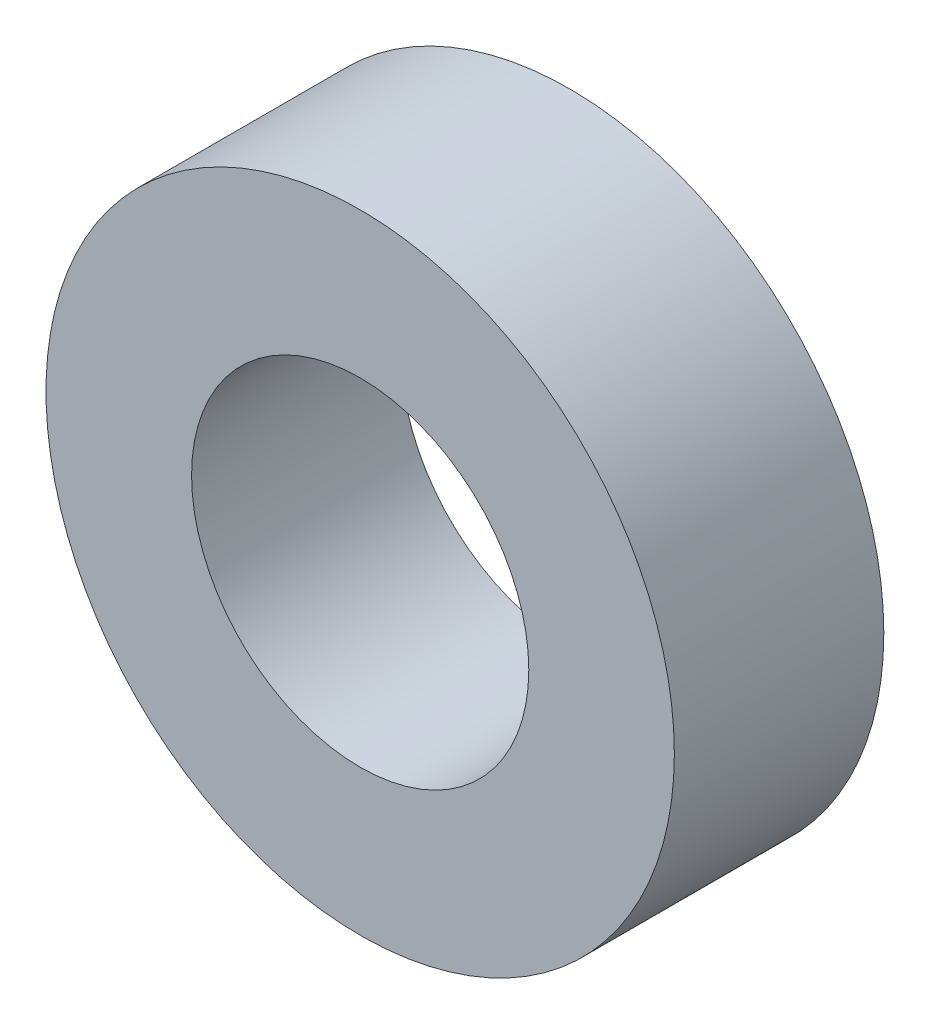
ISO-10303-21;
HEADER;
FILE_DESCRIPTION(('STEP AP214'),'2;1');
FILE_NAME('part.step','',(''),(''),'','','');
FILE_SCHEMA(('AUTOMOTIVE_DESIGN { 1 0 10303 214 1 1 1 1 }'));
ENDSEC;
DATA;
#1=APPLICATION_CONTEXT('core data for automotive mechanical design processes');
#2=APPLICATION_PROTOCOL_DEFINITION('international standard','automotive_design',2000,#1);
#3=PRODUCT_CONTEXT('',#1,'mechanical');
#4=PRODUCT('Part','Part','',(#3));
#5=PRODUCT_RELATED_PRODUCT_CATEGORY('part','',(#4));
#6=PRODUCT_DEFINITION_FORMATION('','',#4);
#7=PRODUCT_DEFINITION_CONTEXT('part definition',#1,'design');
#8=PRODUCT_DEFINITION('design','',#6,#7);
#9=PRODUCT_DEFINITION_SHAPE('','',#8);
#10=(LENGTH_UNIT() NAMED_UNIT(*) SI_UNIT(.MILLI.,.METRE.));
#11=(NAMED_UNIT(*) PLANE_ANGLE_UNIT() SI_UNIT($,.RADIAN.));
#12=(NAMED_UNIT(*) SI_UNIT($,.STERADIAN.) SOLID_ANGLE_UNIT());
#13=UNCERTAINTY_MEASURE_WITH_UNIT(LENGTH_MEASURE(1.E-05),#10,'distance_accuracy_value','');
#14=(GEOMETRIC_REPRESENTATION_CONTEXT(3) GLOBAL_UNCERTAINTY_ASSIGNED_CONTEXT((#13)) GLOBAL_UNIT_ASSIGNED_CONTEXT((#10,
#11,#12)) REPRESENTATION_CONTEXT('',''));
#15=CARTESIAN_POINT('',(0.,0.,0.));
#16=DIRECTION('',(0.,0.,1.));
#17=DIRECTION('',(1.,0.,0.));
#18=AXIS2_PLACEMENT_3D('',#15,#16,#17);
#19=CARTESIAN_POINT('',(0.,0.,2.));
#20=DIRECTION('',(0.,0.,1.));
#21=DIRECTION('',(1.,0.,0.));
#22=AXIS2_PLACEMENT_3D('',#19,#20,#21);
#23=PLANE('',#22);
#24=CARTESIAN_POINT('',(0.,0.,2.));
#25=DIRECTION('',(0.,0.,1.));
#26=DIRECTION('',(1.,0.,0.));
#27=AXIS2_PLACEMENT_3D('',#24,#25,#26);
#28=CIRCLE('',#27,3.);
#29=CARTESIAN_POINT('',(3.,0.,2.));
#30=VERTEX_POINT('',#29);
#31=EDGE_CURVE('E10',#30,#30,#28,.T.);
#32=ORIENTED_EDGE('',*,*,#31,.T.);
#33=EDGE_LOOP('',(#32));
#34=FACE_BOUND('',#33,.T.);
#35=CARTESIAN_POINT('',(0.,0.,2.));
#36=DIRECTION('',(0.,0.,1.));
#37=DIRECTION('',(1.,0.,0.));
#38=AXIS2_PLACEMENT_3D('',#35,#36,#37);
#39=CIRCLE('',#38,1.61);
#40=CARTESIAN_POINT('',(1.61,0.,2.));
#41=VERTEX_POINT('',#40);
#42=EDGE_CURVE('E48',#41,#41,#39,.T.);
#43=ORIENTED_EDGE('',*,*,#42,.F.);
#44=EDGE_LOOP('',(#43));
#45=FACE_BOUND('',#44,.T.);
#46=ADVANCED_FACE('F37',(#34,#45),#23,.T.);
#47=CARTESIAN_POINT('',(0.,0.,0.));
#48=DIRECTION('',(0.,0.,1.));
#49=DIRECTION('',(1.,0.,0.));
#50=AXIS2_PLACEMENT_3D('',#47,#48,#49);
#51=PLANE('',#50);
#52=CARTESIAN_POINT('',(0.,0.,0.));
#53=DIRECTION('',(0.,0.,1.));
#54=DIRECTION('',(1.,0.,0.));
#55=AXIS2_PLACEMENT_3D('',#52,#53,#54);
#56=CIRCLE('',#55,3.);
#57=CARTESIAN_POINT('',(3.,0.,0.));
#58=VERTEX_POINT('',#57);
#59=EDGE_CURVE('E41',#58,#58,#56,.T.);
#60=ORIENTED_EDGE('',*,*,#59,.F.);
#61=EDGE_LOOP('',(#60));
#62=FACE_BOUND('',#61,.T.);
#63=CARTESIAN_POINT('',(0.,0.,0.));
#64=DIRECTION('',(0.,0.,1.));
#65=DIRECTION('',(1.,0.,0.));
#66=AXIS2_PLACEMENT_3D('',#63,#64,#65);
#67=CIRCLE('',#66,1.61);
#68=CARTESIAN_POINT('',(1.61,0.,0.));
#69=VERTEX_POINT('',#68);
#70=EDGE_CURVE('E50',#69,#69,#67,.T.);
#71=ORIENTED_EDGE('',*,*,#70,.T.);
#72=EDGE_LOOP('',(#71));
#73=FACE_BOUND('',#72,.T.);
#74=ADVANCED_FACE('F60',(#62,#73),#51,.F.);
#75=CARTESIAN_POINT('',(0.,0.,2.));
#76=DIRECTION('',(0.,0.,-1.));
#77=DIRECTION('',(-1.,0.,0.));
#78=AXIS2_PLACEMENT_3D('',#75,#76,#77);
#79=CYLINDRICAL_SURFACE('',#78,3.);
#80=ORIENTED_EDGE('',*,*,#31,.F.);
#81=EDGE_LOOP('',(#80));
#82=FACE_BOUND('',#81,.T.);
#83=ORIENTED_EDGE('',*,*,#59,.T.);
#84=EDGE_LOOP('',(#83));
#85=FACE_BOUND('',#84,.T.);
#86=ADVANCED_FACE('F39',(#82,#85),#79,.T.);
#87=CARTESIAN_POINT('',(0.,0.,2.));
#88=DIRECTION('',(0.,0.,-1.));
#89=DIRECTION('',(-1.,0.,0.));
#90=AXIS2_PLACEMENT_3D('',#87,#88,#89);
#91=CYLINDRICAL_SURFACE('',#90,1.61);
#92=ORIENTED_EDGE('',*,*,#42,.T.);
#93=EDGE_LOOP('',(#92));
#94=FACE_BOUND('',#93,.T.);
#95=ORIENTED_EDGE('',*,*,#70,.F.);
#96=EDGE_LOOP('',(#95));
#97=FACE_BOUND('',#96,.T.);
#98=ADVANCED_FACE('F56',(#94,#97),#91,.F.);
#99=CLOSED_SHELL('',(#46,#74,#86,#98));
#100=MANIFOLD_SOLID_BREP('B2',#99);
#101=ADVANCED_BREP_SHAPE_REPRESENTATION('',(#18,#100),#14);
#102=SHAPE_DEFINITION_REPRESENTATION(#9,#101);
ENDSEC;
END-ISO-10303-21;
